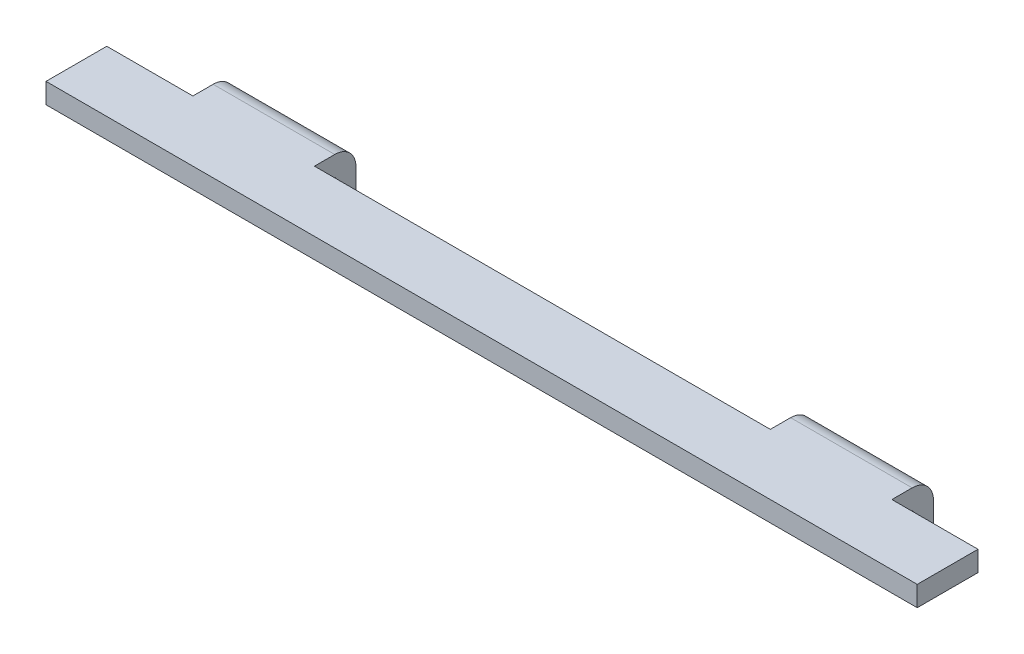
ISO-10303-21;
HEADER;
FILE_DESCRIPTION(('STEP AP214'),'2;1');
FILE_NAME('part.step','',(''),(''),'','','');
FILE_SCHEMA(('AUTOMOTIVE_DESIGN { 1 0 10303 214 1 1 1 1 }'));
ENDSEC;
DATA;
#1=APPLICATION_CONTEXT('core data for automotive mechanical design processes');
#2=APPLICATION_PROTOCOL_DEFINITION('international standard','automotive_design',2000,#1);
#3=PRODUCT_CONTEXT('',#1,'mechanical');
#4=PRODUCT('Part','Part','',(#3));
#5=PRODUCT_RELATED_PRODUCT_CATEGORY('part','',(#4));
#6=PRODUCT_DEFINITION_FORMATION('','',#4);
#7=PRODUCT_DEFINITION_CONTEXT('part definition',#1,'design');
#8=PRODUCT_DEFINITION('design','',#6,#7);
#9=PRODUCT_DEFINITION_SHAPE('','',#8);
#10=(LENGTH_UNIT() NAMED_UNIT(*) SI_UNIT(.MILLI.,.METRE.));
#11=(NAMED_UNIT(*) PLANE_ANGLE_UNIT() SI_UNIT($,.RADIAN.));
#12=(NAMED_UNIT(*) SI_UNIT($,.STERADIAN.) SOLID_ANGLE_UNIT());
#13=UNCERTAINTY_MEASURE_WITH_UNIT(LENGTH_MEASURE(1.E-05),#10,'distance_accuracy_value','');
#14=(GEOMETRIC_REPRESENTATION_CONTEXT(3) GLOBAL_UNCERTAINTY_ASSIGNED_CONTEXT((#13)) GLOBAL_UNIT_ASSIGNED_CONTEXT((#10,
#11,#12)) REPRESENTATION_CONTEXT('',''));
#15=CARTESIAN_POINT('',(0.,0.,0.));
#16=DIRECTION('',(0.,0.,1.));
#17=DIRECTION('',(1.,0.,0.));
#18=AXIS2_PLACEMENT_3D('',#15,#16,#17);
#19=CARTESIAN_POINT('',(0.,0.,-0.71));
#20=DIRECTION('',(0.,0.,-1.));
#21=DIRECTION('',(-1.,0.,0.));
#22=AXIS2_PLACEMENT_3D('',#19,#20,#21);
#23=PLANE('',#22);
#24=DIRECTION('',(0.,1.,0.));
#25=VECTOR('',#24,1.);
#26=CARTESIAN_POINT('',(3.45,0.,-0.71));
#27=LINE('',#26,#25);
#28=CARTESIAN_POINT('',(3.45,-0.66,-0.71));
#29=VERTEX_POINT('',#28);
#30=CARTESIAN_POINT('',(3.45,-0.00999999999999999,-0.71));
#31=VERTEX_POINT('',#30);
#32=EDGE_CURVE('E299',#29,#31,#27,.T.);
#33=ORIENTED_EDGE('',*,*,#32,.F.);
#34=DIRECTION('',(1.,0.,0.));
#35=VECTOR('',#34,1.);
#36=CARTESIAN_POINT('',(3.45,-0.66,-0.71));
#37=LINE('',#36,#35);
#38=CARTESIAN_POINT('',(2.25,-0.66,-0.71));
#39=VERTEX_POINT('',#38);
#40=EDGE_CURVE('E281',#29,#39,#37,.F.);
#41=ORIENTED_EDGE('',*,*,#40,.T.);
#42=DIRECTION('',(0.,1.,0.));
#43=VECTOR('',#42,1.);
#44=CARTESIAN_POINT('',(2.25,0.2,-0.71));
#45=LINE('',#44,#43);
#46=CARTESIAN_POINT('',(2.25,-0.00999999999999999,-0.71));
#47=VERTEX_POINT('',#46);
#48=EDGE_CURVE('E288',#47,#39,#45,.F.);
#49=ORIENTED_EDGE('',*,*,#48,.F.);
#50=DIRECTION('',(-1.,0.,0.));
#51=VECTOR('',#50,1.);
#52=CARTESIAN_POINT('',(2.25,-0.00999999999999998,-0.71));
#53=LINE('',#52,#51);
#54=EDGE_CURVE('E294',#31,#47,#53,.T.);
#55=ORIENTED_EDGE('',*,*,#54,.F.);
#56=EDGE_LOOP('',(#33,#41,#49,#55));
#57=FACE_BOUND('',#56,.T.);
#58=ADVANCED_FACE('F17',(#57),#23,.T.);
#59=CARTESIAN_POINT('',(3.45,-0.66,-0.71));
#60=DIRECTION('',(0.,1.,0.));
#61=DIRECTION('',(0.,0.,1.));
#62=AXIS2_PLACEMENT_3D('',#59,#60,#61);
#63=PLANE('',#62);
#64=DIRECTION('',(0.,0.,1.));
#65=VECTOR('',#64,1.);
#66=CARTESIAN_POINT('',(2.25,-0.66,-0.5));
#67=LINE('',#66,#65);
#68=CARTESIAN_POINT('',(2.25,-0.66,-0.51));
#69=VERTEX_POINT('',#68);
#70=EDGE_CURVE('E284',#39,#69,#67,.T.);
#71=ORIENTED_EDGE('',*,*,#70,.F.);
#72=ORIENTED_EDGE('',*,*,#40,.F.);
#73=DIRECTION('',(0.,0.,-1.));
#74=VECTOR('',#73,1.);
#75=CARTESIAN_POINT('',(3.45,-0.66,-0.5));
#76=LINE('',#75,#74);
#77=CARTESIAN_POINT('',(3.45,-0.66,-0.51));
#78=VERTEX_POINT('',#77);
#79=EDGE_CURVE('E174',#78,#29,#76,.T.);
#80=ORIENTED_EDGE('',*,*,#79,.F.);
#81=DIRECTION('',(-1.,0.,0.));
#82=VECTOR('',#81,1.);
#83=CARTESIAN_POINT('',(0.,-0.66,-0.51));
#84=LINE('',#83,#82);
#85=EDGE_CURVE('E166',#78,#69,#84,.T.);
#86=ORIENTED_EDGE('',*,*,#85,.T.);
#87=EDGE_LOOP('',(#71,#72,#80,#86));
#88=FACE_BOUND('',#87,.T.);
#89=ADVANCED_FACE('F450',(#88),#63,.F.);
#90=CARTESIAN_POINT('',(0.,0.,-0.51));
#91=DIRECTION('',(0.,0.,-1.));
#92=DIRECTION('',(-1.,0.,0.));
#93=AXIS2_PLACEMENT_3D('',#90,#91,#92);
#94=PLANE('',#93);
#95=DIRECTION('',(0.,1.,0.));
#96=VECTOR('',#95,1.);
#97=CARTESIAN_POINT('',(2.25,0.2,-0.51));
#98=LINE('',#97,#96);
#99=CARTESIAN_POINT('',(2.25,-0.01,-0.51));
#100=VERTEX_POINT('',#99);
#101=EDGE_CURVE('E287',#69,#100,#98,.T.);
#102=ORIENTED_EDGE('',*,*,#101,.F.);
#103=ORIENTED_EDGE('',*,*,#85,.F.);
#104=DIRECTION('',(0.,1.,0.));
#105=VECTOR('',#104,1.);
#106=CARTESIAN_POINT('',(3.45,0.,-0.51));
#107=LINE('',#106,#105);
#108=CARTESIAN_POINT('',(3.45,-0.01,-0.51));
#109=VERTEX_POINT('',#108);
#110=EDGE_CURVE('E169',#109,#78,#107,.F.);
#111=ORIENTED_EDGE('',*,*,#110,.F.);
#112=DIRECTION('',(-1.,0.,0.));
#113=VECTOR('',#112,1.);
#114=CARTESIAN_POINT('',(2.25,-0.01,-0.51));
#115=LINE('',#114,#113);
#116=EDGE_CURVE('E156',#109,#100,#115,.T.);
#117=ORIENTED_EDGE('',*,*,#116,.T.);
#118=EDGE_LOOP('',(#102,#103,#111,#117));
#119=FACE_BOUND('',#118,.T.);
#120=ADVANCED_FACE('F170',(#119),#94,.F.);
#121=CARTESIAN_POINT('',(2.25,-0.01,-0.5));
#122=DIRECTION('',(-1.,0.,0.));
#123=DIRECTION('',(0.,0.,1.));
#124=AXIS2_PLACEMENT_3D('',#121,#122,#123);
#125=CYLINDRICAL_SURFACE('',#124,0.01);
#126=DIRECTION('',(1.,0.,0.));
#127=VECTOR('',#126,1.);
#128=CARTESIAN_POINT('',(0.,0.,-0.5));
#129=LINE('',#128,#127);
#130=CARTESIAN_POINT('',(3.45,0.,-0.5));
#131=VERTEX_POINT('',#130);
#132=CARTESIAN_POINT('',(2.25,0.,-0.5));
#133=VERTEX_POINT('',#132);
#134=EDGE_CURVE('E151',#131,#133,#129,.F.);
#135=ORIENTED_EDGE('',*,*,#134,.T.);
#136=CARTESIAN_POINT('',(2.25,-0.01,-0.5));
#137=DIRECTION('',(-1.,0.,0.));
#138=DIRECTION('',(0.,0.,1.));
#139=AXIS2_PLACEMENT_3D('',#136,#137,#138);
#140=CIRCLE('',#139,0.01);
#141=EDGE_CURVE('E162',#100,#133,#140,.F.);
#142=ORIENTED_EDGE('',*,*,#141,.F.);
#143=ORIENTED_EDGE('',*,*,#116,.F.);
#144=CARTESIAN_POINT('',(3.45,-0.01,-0.5));
#145=DIRECTION('',(-1.,0.,0.));
#146=DIRECTION('',(0.,0.,1.));
#147=AXIS2_PLACEMENT_3D('',#144,#145,#146);
#148=CIRCLE('',#147,0.01);
#149=EDGE_CURVE('E20',#131,#109,#148,.T.);
#150=ORIENTED_EDGE('',*,*,#149,.F.);
#151=EDGE_LOOP('',(#135,#142,#143,#150));
#152=FACE_BOUND('',#151,.T.);
#153=ADVANCED_FACE('F158',(#152),#125,.F.);
#154=CARTESIAN_POINT('',(0.,0.,0.));
#155=DIRECTION('',(0.,1.,0.));
#156=DIRECTION('',(0.,0.,1.));
#157=AXIS2_PLACEMENT_3D('',#154,#155,#156);
#158=PLANE('',#157);
#159=DIRECTION('',(1.,0.,0.));
#160=VECTOR('',#159,1.);
#161=CARTESIAN_POINT('',(0.,0.,-0.3));
#162=LINE('',#161,#160);
#163=CARTESIAN_POINT('',(-3.45,0.,-0.3));
#164=VERTEX_POINT('',#163);
#165=CARTESIAN_POINT('',(-4.3,0.,-0.3));
#166=VERTEX_POINT('',#165);
#167=EDGE_CURVE('E254',#164,#166,#162,.F.);
#168=ORIENTED_EDGE('',*,*,#167,.F.);
#169=DIRECTION('',(0.,0.,1.));
#170=VECTOR('',#169,1.);
#171=CARTESIAN_POINT('',(-3.45,0.,0.));
#172=LINE('',#171,#170);
#173=CARTESIAN_POINT('',(-3.45,0.,-0.5));
#174=VERTEX_POINT('',#173);
#175=EDGE_CURVE('E276',#174,#164,#172,.T.);
#176=ORIENTED_EDGE('',*,*,#175,.F.);
#177=DIRECTION('',(-1.,0.,0.));
#178=VECTOR('',#177,1.);
#179=CARTESIAN_POINT('',(-3.45,0.,-0.5));
#180=LINE('',#179,#178);
#181=CARTESIAN_POINT('',(-2.25,0.,-0.5));
#182=VERTEX_POINT('',#181);
#183=EDGE_CURVE('E234',#174,#182,#180,.F.);
#184=ORIENTED_EDGE('',*,*,#183,.T.);
#185=DIRECTION('',(0.,0.,1.));
#186=VECTOR('',#185,1.);
#187=CARTESIAN_POINT('',(-2.25,0.,0.));
#188=LINE('',#187,#186);
#189=CARTESIAN_POINT('',(-2.25,0.,-0.3));
#190=VERTEX_POINT('',#189);
#191=EDGE_CURVE('E274',#190,#182,#188,.F.);
#192=ORIENTED_EDGE('',*,*,#191,.F.);
#193=DIRECTION('',(1.,0.,0.));
#194=VECTOR('',#193,1.);
#195=CARTESIAN_POINT('',(4.3,0.,-0.3));
#196=LINE('',#195,#194);
#197=CARTESIAN_POINT('',(2.25,0.,-0.3));
#198=VERTEX_POINT('',#197);
#199=EDGE_CURVE('E268',#190,#198,#196,.T.);
#200=ORIENTED_EDGE('',*,*,#199,.T.);
#201=DIRECTION('',(0.,0.,1.));
#202=VECTOR('',#201,1.);
#203=CARTESIAN_POINT('',(2.25,0.,-0.5));
#204=LINE('',#203,#202);
#205=EDGE_CURVE('E271',#133,#198,#204,.T.);
#206=ORIENTED_EDGE('',*,*,#205,.F.);
#207=ORIENTED_EDGE('',*,*,#134,.F.);
#208=DIRECTION('',(0.,0.,-1.));
#209=VECTOR('',#208,1.);
#210=CARTESIAN_POINT('',(3.45,0.,-0.5));
#211=LINE('',#210,#209);
#212=CARTESIAN_POINT('',(3.45,0.,-0.3));
#213=VERTEX_POINT('',#212);
#214=EDGE_CURVE('E178',#213,#131,#211,.T.);
#215=ORIENTED_EDGE('',*,*,#214,.F.);
#216=DIRECTION('',(1.,0.,0.));
#217=VECTOR('',#216,1.);
#218=CARTESIAN_POINT('',(4.3,0.,-0.3));
#219=LINE('',#218,#217);
#220=CARTESIAN_POINT('',(4.3,0.,-0.3));
#221=VERTEX_POINT('',#220);
#222=EDGE_CURVE('E181',#213,#221,#219,.T.);
#223=ORIENTED_EDGE('',*,*,#222,.T.);
#224=DIRECTION('',(0.,0.,1.));
#225=VECTOR('',#224,1.);
#226=CARTESIAN_POINT('',(4.3,0.,0.3));
#227=LINE('',#226,#225);
#228=CARTESIAN_POINT('',(4.3,0.,0.300000000000001));
#229=VERTEX_POINT('',#228);
#230=EDGE_CURVE('E199',#221,#229,#227,.T.);
#231=ORIENTED_EDGE('',*,*,#230,.T.);
#232=DIRECTION('',(-1.,0.,0.));
#233=VECTOR('',#232,1.);
#234=CARTESIAN_POINT('',(-4.3,0.,0.3));
#235=LINE('',#234,#233);
#236=CARTESIAN_POINT('',(-4.3,0.,0.3));
#237=VERTEX_POINT('',#236);
#238=EDGE_CURVE('E209',#229,#237,#235,.T.);
#239=ORIENTED_EDGE('',*,*,#238,.T.);
#240=DIRECTION('',(0.,0.,-1.));
#241=VECTOR('',#240,1.);
#242=CARTESIAN_POINT('',(-4.3,0.,-0.3));
#243=LINE('',#242,#241);
#244=EDGE_CURVE('E219',#237,#166,#243,.T.);
#245=ORIENTED_EDGE('',*,*,#244,.T.);
#246=EDGE_LOOP('',(#168,#176,#184,#192,#200,#206,#207,#215,#223,#231,#239,#245));
#247=FACE_BOUND('',#246,.T.);
#248=ADVANCED_FACE('F420',(#247),#158,.F.);
#249=CARTESIAN_POINT('',(0.,0.,-0.71));
#250=DIRECTION('',(0.,0.,-1.));
#251=DIRECTION('',(0.,1.,0.));
#252=AXIS2_PLACEMENT_3D('',#249,#250,#251);
#253=PLANE('',#252);
#254=DIRECTION('',(0.,1.,0.));
#255=VECTOR('',#254,1.);
#256=CARTESIAN_POINT('',(-2.25,0.,-0.71));
#257=LINE('',#256,#255);
#258=CARTESIAN_POINT('',(-2.25,-0.66,-0.71));
#259=VERTEX_POINT('',#258);
#260=CARTESIAN_POINT('',(-2.25,-0.00999999999999999,-0.71));
#261=VERTEX_POINT('',#260);
#262=EDGE_CURVE('E264',#259,#261,#257,.T.);
#263=ORIENTED_EDGE('',*,*,#262,.F.);
#264=DIRECTION('',(1.,0.,0.));
#265=VECTOR('',#264,1.);
#266=CARTESIAN_POINT('',(-2.25,-0.66,-0.71));
#267=LINE('',#266,#265);
#268=CARTESIAN_POINT('',(-3.45,-0.66,-0.71));
#269=VERTEX_POINT('',#268);
#270=EDGE_CURVE('E243',#259,#269,#267,.F.);
#271=ORIENTED_EDGE('',*,*,#270,.T.);
#272=DIRECTION('',(0.,1.,0.));
#273=VECTOR('',#272,1.);
#274=CARTESIAN_POINT('',(-3.45,0.2,-0.71));
#275=LINE('',#274,#273);
#276=CARTESIAN_POINT('',(-3.45,-0.00999999999999999,-0.71));
#277=VERTEX_POINT('',#276);
#278=EDGE_CURVE('E250',#277,#269,#275,.F.);
#279=ORIENTED_EDGE('',*,*,#278,.F.);
#280=DIRECTION('',(-1.,0.,0.));
#281=VECTOR('',#280,1.);
#282=CARTESIAN_POINT('',(-3.45,-0.00999999999999998,-0.71));
#283=LINE('',#282,#281);
#284=EDGE_CURVE('E257',#261,#277,#283,.T.);
#285=ORIENTED_EDGE('',*,*,#284,.F.);
#286=EDGE_LOOP('',(#263,#271,#279,#285));
#287=FACE_BOUND('',#286,.T.);
#288=ADVANCED_FACE('F434',(#287),#253,.T.);
#289=CARTESIAN_POINT('',(-2.25,-0.66,-0.71));
#290=DIRECTION('',(0.,1.,0.));
#291=DIRECTION('',(0.,0.,1.));
#292=AXIS2_PLACEMENT_3D('',#289,#290,#291);
#293=PLANE('',#292);
#294=DIRECTION('',(0.,0.,1.));
#295=VECTOR('',#294,1.);
#296=CARTESIAN_POINT('',(-3.45,-0.66,-0.5));
#297=LINE('',#296,#295);
#298=CARTESIAN_POINT('',(-3.45,-0.66,-0.51));
#299=VERTEX_POINT('',#298);
#300=EDGE_CURVE('E246',#269,#299,#297,.T.);
#301=ORIENTED_EDGE('',*,*,#300,.F.);
#302=ORIENTED_EDGE('',*,*,#270,.F.);
#303=DIRECTION('',(0.,0.,-1.));
#304=VECTOR('',#303,1.);
#305=CARTESIAN_POINT('',(-2.25,-0.66,-0.5));
#306=LINE('',#305,#304);
#307=CARTESIAN_POINT('',(-2.25,-0.66,-0.51));
#308=VERTEX_POINT('',#307);
#309=EDGE_CURVE('E261',#308,#259,#306,.T.);
#310=ORIENTED_EDGE('',*,*,#309,.F.);
#311=DIRECTION('',(1.,0.,0.));
#312=VECTOR('',#311,1.);
#313=CARTESIAN_POINT('',(0.,-0.66,-0.51));
#314=LINE('',#313,#312);
#315=EDGE_CURVE('E239',#308,#299,#314,.F.);
#316=ORIENTED_EDGE('',*,*,#315,.T.);
#317=EDGE_LOOP('',(#301,#302,#310,#316));
#318=FACE_BOUND('',#317,.T.);
#319=ADVANCED_FACE('F436',(#318),#293,.F.);
#320=CARTESIAN_POINT('',(0.,0.,-0.51));
#321=DIRECTION('',(0.,0.,-1.));
#322=DIRECTION('',(0.,1.,0.));
#323=AXIS2_PLACEMENT_3D('',#320,#321,#322);
#324=PLANE('',#323);
#325=DIRECTION('',(0.,1.,0.));
#326=VECTOR('',#325,1.);
#327=CARTESIAN_POINT('',(-3.45,0.2,-0.51));
#328=LINE('',#327,#326);
#329=CARTESIAN_POINT('',(-3.45,-0.01,-0.51));
#330=VERTEX_POINT('',#329);
#331=EDGE_CURVE('E249',#299,#330,#328,.T.);
#332=ORIENTED_EDGE('',*,*,#331,.F.);
#333=ORIENTED_EDGE('',*,*,#315,.F.);
#334=DIRECTION('',(0.,1.,0.));
#335=VECTOR('',#334,1.);
#336=CARTESIAN_POINT('',(-2.25,0.,-0.51));
#337=LINE('',#336,#335);
#338=CARTESIAN_POINT('',(-2.25,-0.01,-0.51));
#339=VERTEX_POINT('',#338);
#340=EDGE_CURVE('E265',#339,#308,#337,.F.);
#341=ORIENTED_EDGE('',*,*,#340,.F.);
#342=DIRECTION('',(-1.,0.,0.));
#343=VECTOR('',#342,1.);
#344=CARTESIAN_POINT('',(-3.45,-0.01,-0.51));
#345=LINE('',#344,#343);
#346=EDGE_CURVE('E237',#339,#330,#345,.T.);
#347=ORIENTED_EDGE('',*,*,#346,.T.);
#348=EDGE_LOOP('',(#332,#333,#341,#347));
#349=FACE_BOUND('',#348,.T.);
#350=ADVANCED_FACE('F412',(#349),#324,.F.);
#351=CARTESIAN_POINT('',(-3.45,-0.01,-0.5));
#352=DIRECTION('',(-1.,0.,0.));
#353=DIRECTION('',(0.,0.,1.));
#354=AXIS2_PLACEMENT_3D('',#351,#352,#353);
#355=CYLINDRICAL_SURFACE('',#354,0.01);
#356=ORIENTED_EDGE('',*,*,#183,.F.);
#357=CARTESIAN_POINT('',(-3.45,-0.01,-0.5));
#358=DIRECTION('',(-1.,0.,0.));
#359=DIRECTION('',(0.,0.,1.));
#360=AXIS2_PLACEMENT_3D('',#357,#358,#359);
#361=CIRCLE('',#360,0.01);
#362=EDGE_CURVE('E229',#330,#174,#361,.F.);
#363=ORIENTED_EDGE('',*,*,#362,.F.);
#364=ORIENTED_EDGE('',*,*,#346,.F.);
#365=CARTESIAN_POINT('',(-2.25,-0.01,-0.5));
#366=DIRECTION('',(-1.,0.,0.));
#367=DIRECTION('',(0.,0.,1.));
#368=AXIS2_PLACEMENT_3D('',#365,#366,#367);
#369=CIRCLE('',#368,0.01);
#370=EDGE_CURVE('E326',#182,#339,#369,.T.);
#371=ORIENTED_EDGE('',*,*,#370,.F.);
#372=EDGE_LOOP('',(#356,#363,#364,#371));
#373=FACE_BOUND('',#372,.T.);
#374=ADVANCED_FACE('F418',(#373),#355,.F.);
#375=CARTESIAN_POINT('',(-4.3,0.2,-0.3));
#376=DIRECTION('',(1.,0.,0.));
#377=DIRECTION('',(0.,0.,-1.));
#378=AXIS2_PLACEMENT_3D('',#375,#376,#377);
#379=PLANE('',#378);
#380=DIRECTION('',(0.,1.,0.));
#381=VECTOR('',#380,1.);
#382=CARTESIAN_POINT('',(-4.3,0.2,0.3));
#383=LINE('',#382,#381);
#384=CARTESIAN_POINT('',(-4.3,0.2,0.3));
#385=VERTEX_POINT('',#384);
#386=EDGE_CURVE('E217',#237,#385,#383,.T.);
#387=ORIENTED_EDGE('',*,*,#386,.T.);
#388=DIRECTION('',(0.,0.,1.));
#389=VECTOR('',#388,1.);
#390=CARTESIAN_POINT('',(-4.3,0.2,0.));
#391=LINE('',#390,#389);
#392=CARTESIAN_POINT('',(-4.3,0.2,-0.3));
#393=VERTEX_POINT('',#392);
#394=EDGE_CURVE('E214',#393,#385,#391,.T.);
#395=ORIENTED_EDGE('',*,*,#394,.F.);
#396=DIRECTION('',(0.,1.,0.));
#397=VECTOR('',#396,1.);
#398=CARTESIAN_POINT('',(-4.3,0.2,-0.3));
#399=LINE('',#398,#397);
#400=EDGE_CURVE('E226',#393,#166,#399,.F.);
#401=ORIENTED_EDGE('',*,*,#400,.T.);
#402=ORIENTED_EDGE('',*,*,#244,.F.);
#403=EDGE_LOOP('',(#387,#395,#401,#402));
#404=FACE_BOUND('',#403,.T.);
#405=ADVANCED_FACE('F467',(#404),#379,.F.);
#406=CARTESIAN_POINT('',(-4.3,0.2,0.3));
#407=DIRECTION('',(0.,0.,-1.));
#408=DIRECTION('',(-1.,0.,0.));
#409=AXIS2_PLACEMENT_3D('',#406,#407,#408);
#410=PLANE('',#409);
#411=DIRECTION('',(0.,1.,0.));
#412=VECTOR('',#411,1.);
#413=CARTESIAN_POINT('',(4.3,0.2,0.3));
#414=LINE('',#413,#412);
#415=CARTESIAN_POINT('',(4.3,0.2,0.3));
#416=VERTEX_POINT('',#415);
#417=EDGE_CURVE('E207',#229,#416,#414,.T.);
#418=ORIENTED_EDGE('',*,*,#417,.T.);
#419=DIRECTION('',(1.,0.,0.));
#420=VECTOR('',#419,1.);
#421=CARTESIAN_POINT('',(0.,0.2,0.3));
#422=LINE('',#421,#420);
#423=EDGE_CURVE('E204',#385,#416,#422,.T.);
#424=ORIENTED_EDGE('',*,*,#423,.F.);
#425=ORIENTED_EDGE('',*,*,#386,.F.);
#426=ORIENTED_EDGE('',*,*,#238,.F.);
#427=EDGE_LOOP('',(#418,#424,#425,#426));
#428=FACE_BOUND('',#427,.T.);
#429=ADVANCED_FACE('F465',(#428),#410,.F.);
#430=CARTESIAN_POINT('',(4.3,0.2,0.3));
#431=DIRECTION('',(-1.,0.,0.));
#432=DIRECTION('',(0.,0.,1.));
#433=AXIS2_PLACEMENT_3D('',#430,#431,#432);
#434=PLANE('',#433);
#435=DIRECTION('',(0.,1.,0.));
#436=VECTOR('',#435,1.);
#437=CARTESIAN_POINT('',(4.3,0.2,-0.3));
#438=LINE('',#437,#436);
#439=CARTESIAN_POINT('',(4.3,0.2,-0.3));
#440=VERTEX_POINT('',#439);
#441=EDGE_CURVE('E197',#221,#440,#438,.T.);
#442=ORIENTED_EDGE('',*,*,#441,.T.);
#443=DIRECTION('',(0.,0.,1.));
#444=VECTOR('',#443,1.);
#445=CARTESIAN_POINT('',(4.3,0.2,0.));
#446=LINE('',#445,#444);
#447=EDGE_CURVE('E194',#416,#440,#446,.F.);
#448=ORIENTED_EDGE('',*,*,#447,.F.);
#449=ORIENTED_EDGE('',*,*,#417,.F.);
#450=ORIENTED_EDGE('',*,*,#230,.F.);
#451=EDGE_LOOP('',(#442,#448,#449,#450));
#452=FACE_BOUND('',#451,.T.);
#453=ADVANCED_FACE('F462',(#452),#434,.F.);
#454=CARTESIAN_POINT('',(4.3,0.2,-0.3));
#455=DIRECTION('',(0.,0.,1.));
#456=DIRECTION('',(1.,0.,0.));
#457=AXIS2_PLACEMENT_3D('',#454,#455,#456);
#458=PLANE('',#457);
#459=DIRECTION('',(0.,1.,0.));
#460=VECTOR('',#459,1.);
#461=CARTESIAN_POINT('',(3.45,0.,-0.3));
#462=LINE('',#461,#460);
#463=CARTESIAN_POINT('',(3.45,0.2,-0.3));
#464=VERTEX_POINT('',#463);
#465=EDGE_CURVE('E179',#464,#213,#462,.F.);
#466=ORIENTED_EDGE('',*,*,#465,.F.);
#467=DIRECTION('',(1.,0.,0.));
#468=VECTOR('',#467,1.);
#469=CARTESIAN_POINT('',(0.,0.2,-0.3));
#470=LINE('',#469,#468);
#471=EDGE_CURVE('E190',#440,#464,#470,.F.);
#472=ORIENTED_EDGE('',*,*,#471,.F.);
#473=ORIENTED_EDGE('',*,*,#441,.F.);
#474=ORIENTED_EDGE('',*,*,#222,.F.);
#475=EDGE_LOOP('',(#466,#472,#473,#474));
#476=FACE_BOUND('',#475,.T.);
#477=ADVANCED_FACE('F456',(#476),#458,.F.);
#478=CARTESIAN_POINT('',(3.45,0.,-0.5));
#479=DIRECTION('',(1.,0.,0.));
#480=DIRECTION('',(0.,0.,-1.));
#481=AXIS2_PLACEMENT_3D('',#478,#479,#480);
#482=PLANE('',#481);
#483=CARTESIAN_POINT('',(3.45,-0.01,-0.5));
#484=DIRECTION('',(-1.,0.,0.));
#485=DIRECTION('',(0.,0.,1.));
#486=AXIS2_PLACEMENT_3D('',#483,#484,#485);
#487=CIRCLE('',#486,0.21);
#488=CARTESIAN_POINT('',(3.45,0.2,-0.5));
#489=VERTEX_POINT('',#488);
#490=EDGE_CURVE('E297',#489,#31,#487,.T.);
#491=ORIENTED_EDGE('',*,*,#490,.F.);
#492=DIRECTION('',(0.,0.,1.));
#493=VECTOR('',#492,1.);
#494=CARTESIAN_POINT('',(3.45,0.2,0.));
#495=LINE('',#494,#493);
#496=EDGE_CURVE('E193',#464,#489,#495,.F.);
#497=ORIENTED_EDGE('',*,*,#496,.F.);
#498=ORIENTED_EDGE('',*,*,#465,.T.);
#499=ORIENTED_EDGE('',*,*,#214,.T.);
#500=ORIENTED_EDGE('',*,*,#149,.T.);
#501=ORIENTED_EDGE('',*,*,#110,.T.);
#502=ORIENTED_EDGE('',*,*,#79,.T.);
#503=ORIENTED_EDGE('',*,*,#32,.T.);
#504=EDGE_LOOP('',(#491,#497,#498,#499,#500,#501,#502,#503));
#505=FACE_BOUND('',#504,.T.);
#506=ADVANCED_FACE('F176',(#505),#482,.T.);
#507=CARTESIAN_POINT('',(2.25,-0.01,-0.5));
#508=DIRECTION('',(-1.,0.,0.));
#509=DIRECTION('',(0.,0.,1.));
#510=AXIS2_PLACEMENT_3D('',#507,#508,#509);
#511=CYLINDRICAL_SURFACE('',#510,0.21);
#512=CARTESIAN_POINT('',(2.25,-0.01,-0.5));
#513=DIRECTION('',(-1.,0.,0.));
#514=DIRECTION('',(0.,0.,1.));
#515=AXIS2_PLACEMENT_3D('',#512,#513,#514);
#516=CIRCLE('',#515,0.21);
#517=CARTESIAN_POINT('',(2.25,0.2,-0.5));
#518=VERTEX_POINT('',#517);
#519=EDGE_CURVE('E296',#518,#47,#516,.T.);
#520=ORIENTED_EDGE('',*,*,#519,.F.);
#521=DIRECTION('',(1.,0.,0.));
#522=VECTOR('',#521,1.);
#523=CARTESIAN_POINT('',(0.,0.2,-0.5));
#524=LINE('',#523,#522);
#525=EDGE_CURVE('E345',#489,#518,#524,.F.);
#526=ORIENTED_EDGE('',*,*,#525,.F.);
#527=ORIENTED_EDGE('',*,*,#490,.T.);
#528=ORIENTED_EDGE('',*,*,#54,.T.);
#529=EDGE_LOOP('',(#520,#526,#527,#528));
#530=FACE_BOUND('',#529,.T.);
#531=ADVANCED_FACE('F452',(#530),#511,.T.);
#532=CARTESIAN_POINT('',(2.25,0.2,-0.5));
#533=DIRECTION('',(-1.,0.,0.));
#534=DIRECTION('',(0.,0.,1.));
#535=AXIS2_PLACEMENT_3D('',#532,#533,#534);
#536=PLANE('',#535);
#537=ORIENTED_EDGE('',*,*,#141,.T.);
#538=ORIENTED_EDGE('',*,*,#205,.T.);
#539=DIRECTION('',(0.,1.,0.));
#540=VECTOR('',#539,1.);
#541=CARTESIAN_POINT('',(2.25,0.2,-0.3));
#542=LINE('',#541,#540);
#543=CARTESIAN_POINT('',(2.25,0.2,-0.3));
#544=VERTEX_POINT('',#543);
#545=EDGE_CURVE('E270',#198,#544,#542,.T.);
#546=ORIENTED_EDGE('',*,*,#545,.T.);
#547=DIRECTION('',(0.,0.,1.));
#548=VECTOR('',#547,1.);
#549=CARTESIAN_POINT('',(2.25,0.2,0.));
#550=LINE('',#549,#548);
#551=EDGE_CURVE('E348',#518,#544,#550,.T.);
#552=ORIENTED_EDGE('',*,*,#551,.F.);
#553=ORIENTED_EDGE('',*,*,#519,.T.);
#554=ORIENTED_EDGE('',*,*,#48,.T.);
#555=ORIENTED_EDGE('',*,*,#70,.T.);
#556=ORIENTED_EDGE('',*,*,#101,.T.);
#557=EDGE_LOOP('',(#537,#538,#546,#552,#553,#554,#555,#556));
#558=FACE_BOUND('',#557,.T.);
#559=ADVANCED_FACE('F445',(#558),#536,.T.);
#560=CARTESIAN_POINT('',(4.3,0.2,-0.3));
#561=DIRECTION('',(0.,0.,1.));
#562=DIRECTION('',(1.,0.,0.));
#563=AXIS2_PLACEMENT_3D('',#560,#561,#562);
#564=PLANE('',#563);
#565=ORIENTED_EDGE('',*,*,#545,.F.);
#566=ORIENTED_EDGE('',*,*,#199,.F.);
#567=DIRECTION('',(0.,1.,0.));
#568=VECTOR('',#567,1.);
#569=CARTESIAN_POINT('',(-2.25,0.,-0.3));
#570=LINE('',#569,#568);
#571=CARTESIAN_POINT('',(-2.25,0.2,-0.3));
#572=VERTEX_POINT('',#571);
#573=EDGE_CURVE('E329',#572,#190,#570,.F.);
#574=ORIENTED_EDGE('',*,*,#573,.F.);
#575=DIRECTION('',(1.,0.,0.));
#576=VECTOR('',#575,1.);
#577=CARTESIAN_POINT('',(0.,0.2,-0.3));
#578=LINE('',#577,#576);
#579=EDGE_CURVE('E364',#544,#572,#578,.F.);
#580=ORIENTED_EDGE('',*,*,#579,.F.);
#581=EDGE_LOOP('',(#565,#566,#574,#580));
#582=FACE_BOUND('',#581,.T.);
#583=ADVANCED_FACE('F443',(#582),#564,.F.);
#584=CARTESIAN_POINT('',(-2.25,0.,-0.5));
#585=DIRECTION('',(1.,0.,0.));
#586=DIRECTION('',(0.,0.,-1.));
#587=AXIS2_PLACEMENT_3D('',#584,#585,#586);
#588=PLANE('',#587);
#589=CARTESIAN_POINT('',(-2.25,-0.01,-0.5));
#590=DIRECTION('',(-1.,0.,0.));
#591=DIRECTION('',(0.,0.,1.));
#592=AXIS2_PLACEMENT_3D('',#589,#590,#591);
#593=CIRCLE('',#592,0.21);
#594=CARTESIAN_POINT('',(-2.25,0.2,-0.5));
#595=VERTEX_POINT('',#594);
#596=EDGE_CURVE('E260',#595,#261,#593,.T.);
#597=ORIENTED_EDGE('',*,*,#596,.F.);
#598=DIRECTION('',(0.,0.,1.));
#599=VECTOR('',#598,1.);
#600=CARTESIAN_POINT('',(-2.25,0.2,0.));
#601=LINE('',#600,#599);
#602=EDGE_CURVE('E372',#572,#595,#601,.F.);
#603=ORIENTED_EDGE('',*,*,#602,.F.);
#604=ORIENTED_EDGE('',*,*,#573,.T.);
#605=ORIENTED_EDGE('',*,*,#191,.T.);
#606=ORIENTED_EDGE('',*,*,#370,.T.);
#607=ORIENTED_EDGE('',*,*,#340,.T.);
#608=ORIENTED_EDGE('',*,*,#309,.T.);
#609=ORIENTED_EDGE('',*,*,#262,.T.);
#610=EDGE_LOOP('',(#597,#603,#604,#605,#606,#607,#608,#609));
#611=FACE_BOUND('',#610,.T.);
#612=ADVANCED_FACE('F438',(#611),#588,.T.);
#613=CARTESIAN_POINT('',(-3.45,-0.01,-0.5));
#614=DIRECTION('',(-1.,0.,0.));
#615=DIRECTION('',(0.,0.,1.));
#616=AXIS2_PLACEMENT_3D('',#613,#614,#615);
#617=CYLINDRICAL_SURFACE('',#616,0.21);
#618=CARTESIAN_POINT('',(-3.45,-0.01,-0.5));
#619=DIRECTION('',(-1.,0.,0.));
#620=DIRECTION('',(0.,0.,1.));
#621=AXIS2_PLACEMENT_3D('',#618,#619,#620);
#622=CIRCLE('',#621,0.21);
#623=CARTESIAN_POINT('',(-3.45,0.2,-0.5));
#624=VERTEX_POINT('',#623);
#625=EDGE_CURVE('E259',#624,#277,#622,.T.);
#626=ORIENTED_EDGE('',*,*,#625,.F.);
#627=DIRECTION('',(1.,0.,0.));
#628=VECTOR('',#627,1.);
#629=CARTESIAN_POINT('',(0.,0.2,-0.5));
#630=LINE('',#629,#628);
#631=EDGE_CURVE('E388',#595,#624,#630,.F.);
#632=ORIENTED_EDGE('',*,*,#631,.F.);
#633=ORIENTED_EDGE('',*,*,#596,.T.);
#634=ORIENTED_EDGE('',*,*,#284,.T.);
#635=EDGE_LOOP('',(#626,#632,#633,#634));
#636=FACE_BOUND('',#635,.T.);
#637=ADVANCED_FACE('F430',(#636),#617,.T.);
#638=CARTESIAN_POINT('',(-3.45,0.2,-0.5));
#639=DIRECTION('',(-1.,0.,0.));
#640=DIRECTION('',(0.,0.,1.));
#641=AXIS2_PLACEMENT_3D('',#638,#639,#640);
#642=PLANE('',#641);
#643=ORIENTED_EDGE('',*,*,#362,.T.);
#644=ORIENTED_EDGE('',*,*,#175,.T.);
#645=DIRECTION('',(0.,1.,0.));
#646=VECTOR('',#645,1.);
#647=CARTESIAN_POINT('',(-3.45,0.2,-0.3));
#648=LINE('',#647,#646);
#649=CARTESIAN_POINT('',(-3.45,0.2,-0.3));
#650=VERTEX_POINT('',#649);
#651=EDGE_CURVE('E35',#164,#650,#648,.T.);
#652=ORIENTED_EDGE('',*,*,#651,.T.);
#653=DIRECTION('',(0.,0.,1.));
#654=VECTOR('',#653,1.);
#655=CARTESIAN_POINT('',(-3.45,0.2,0.));
#656=LINE('',#655,#654);
#657=EDGE_CURVE('E26',#624,#650,#656,.T.);
#658=ORIENTED_EDGE('',*,*,#657,.F.);
#659=ORIENTED_EDGE('',*,*,#625,.T.);
#660=ORIENTED_EDGE('',*,*,#278,.T.);
#661=ORIENTED_EDGE('',*,*,#300,.T.);
#662=ORIENTED_EDGE('',*,*,#331,.T.);
#663=EDGE_LOOP('',(#643,#644,#652,#658,#659,#660,#661,#662));
#664=FACE_BOUND('',#663,.T.);
#665=ADVANCED_FACE('F408',(#664),#642,.T.);
#666=CARTESIAN_POINT('',(4.3,0.2,-0.3));
#667=DIRECTION('',(0.,0.,1.));
#668=DIRECTION('',(1.,0.,0.));
#669=AXIS2_PLACEMENT_3D('',#666,#667,#668);
#670=PLANE('',#669);
#671=ORIENTED_EDGE('',*,*,#651,.F.);
#672=ORIENTED_EDGE('',*,*,#167,.T.);
#673=ORIENTED_EDGE('',*,*,#400,.F.);
#674=DIRECTION('',(1.,0.,0.));
#675=VECTOR('',#674,1.);
#676=CARTESIAN_POINT('',(0.,0.2,-0.3));
#677=LINE('',#676,#675);
#678=EDGE_CURVE('E11',#650,#393,#677,.F.);
#679=ORIENTED_EDGE('',*,*,#678,.F.);
#680=EDGE_LOOP('',(#671,#672,#673,#679));
#681=FACE_BOUND('',#680,.T.);
#682=ADVANCED_FACE('F423',(#681),#670,.F.);
#683=CARTESIAN_POINT('',(0.,0.2,0.));
#684=DIRECTION('',(0.,1.,0.));
#685=DIRECTION('',(0.,0.,1.));
#686=AXIS2_PLACEMENT_3D('',#683,#684,#685);
#687=PLANE('',#686);
#688=ORIENTED_EDGE('',*,*,#657,.T.);
#689=ORIENTED_EDGE('',*,*,#678,.T.);
#690=ORIENTED_EDGE('',*,*,#394,.T.);
#691=ORIENTED_EDGE('',*,*,#423,.T.);
#692=ORIENTED_EDGE('',*,*,#447,.T.);
#693=ORIENTED_EDGE('',*,*,#471,.T.);
#694=ORIENTED_EDGE('',*,*,#496,.T.);
#695=ORIENTED_EDGE('',*,*,#525,.T.);
#696=ORIENTED_EDGE('',*,*,#551,.T.);
#697=ORIENTED_EDGE('',*,*,#579,.T.);
#698=ORIENTED_EDGE('',*,*,#602,.T.);
#699=ORIENTED_EDGE('',*,*,#631,.T.);
#700=EDGE_LOOP('',(#688,#689,#690,#691,#692,#693,#694,#695,#696,#697,#698,#699));
#701=FACE_BOUND('',#700,.T.);
#702=ADVANCED_FACE('F426',(#701),#687,.T.);
#703=CLOSED_SHELL('',(#58,#89,#120,#153,#248,#288,#319,#350,#374,#405,#429,#453,#477,#506,#531,
#559,#583,#612,#637,#665,#682,#702));
#704=MANIFOLD_SOLID_BREP('B1',#703);
#705=ADVANCED_BREP_SHAPE_REPRESENTATION('',(#18,#704),#14);
#706=SHAPE_DEFINITION_REPRESENTATION(#9,#705);
ENDSEC;
END-ISO-10303-21;
